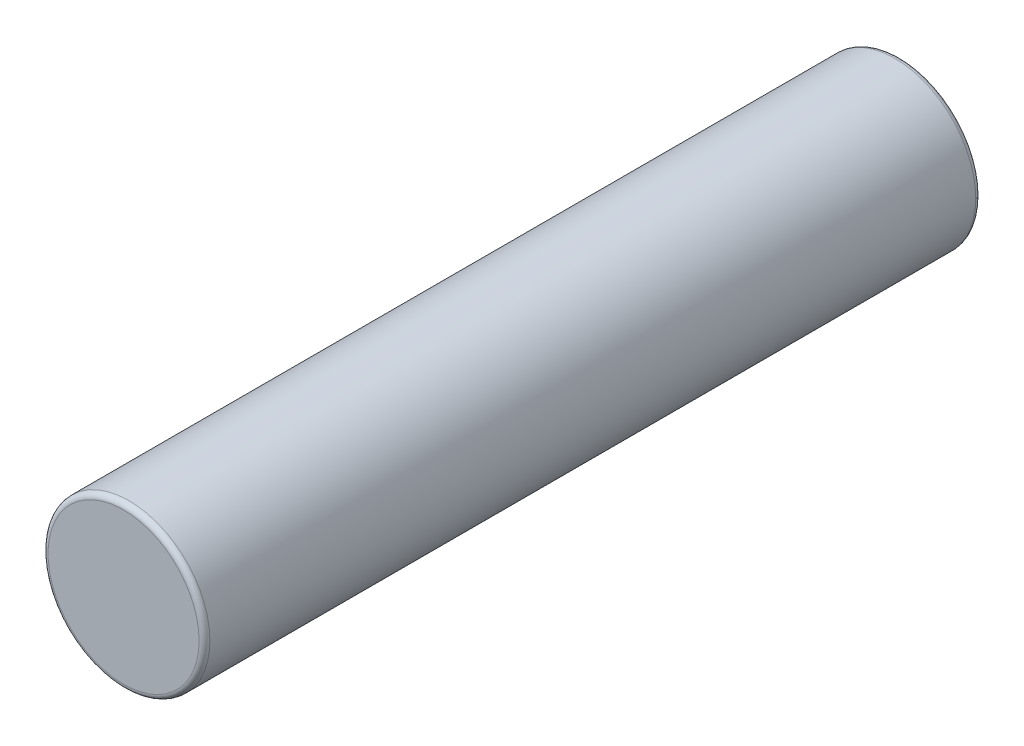
ISO-10303-21;
HEADER;
FILE_DESCRIPTION(('STEP AP214'),'2;1');
FILE_NAME('part.step','',(''),(''),'','','');
FILE_SCHEMA(('AUTOMOTIVE_DESIGN { 1 0 10303 214 1 1 1 1 }'));
ENDSEC;
DATA;
#1=APPLICATION_CONTEXT('core data for automotive mechanical design processes');
#2=APPLICATION_PROTOCOL_DEFINITION('international standard','automotive_design',2000,#1);
#3=PRODUCT_CONTEXT('',#1,'mechanical');
#4=PRODUCT('Part','Part','',(#3));
#5=PRODUCT_RELATED_PRODUCT_CATEGORY('part','',(#4));
#6=PRODUCT_DEFINITION_FORMATION('','',#4);
#7=PRODUCT_DEFINITION_CONTEXT('part definition',#1,'design');
#8=PRODUCT_DEFINITION('design','',#6,#7);
#9=PRODUCT_DEFINITION_SHAPE('','',#8);
#10=(LENGTH_UNIT() NAMED_UNIT(*) SI_UNIT(.MILLI.,.METRE.));
#11=(NAMED_UNIT(*) PLANE_ANGLE_UNIT() SI_UNIT($,.RADIAN.));
#12=(NAMED_UNIT(*) SI_UNIT($,.STERADIAN.) SOLID_ANGLE_UNIT());
#13=UNCERTAINTY_MEASURE_WITH_UNIT(LENGTH_MEASURE(1.E-05),#10,'distance_accuracy_value','');
#14=(GEOMETRIC_REPRESENTATION_CONTEXT(3) GLOBAL_UNCERTAINTY_ASSIGNED_CONTEXT((#13)) GLOBAL_UNIT_ASSIGNED_CONTEXT((#10,
#11,#12)) REPRESENTATION_CONTEXT('',''));
#15=CARTESIAN_POINT('',(0.,0.,0.));
#16=DIRECTION('',(0.,0.,1.));
#17=DIRECTION('',(1.,0.,0.));
#18=AXIS2_PLACEMENT_3D('',#15,#16,#17);
#19=CARTESIAN_POINT('',(0.,0.,7.2));
#20=DIRECTION('',(0.,0.,-1.));
#21=DIRECTION('',(-1.,0.,0.));
#22=AXIS2_PLACEMENT_3D('',#19,#20,#21);
#23=CYLINDRICAL_SURFACE('',#22,0.75);
#24=CARTESIAN_POINT('',(0.,0.,0.0500000000000014));
#25=DIRECTION('',(0.,0.,1.));
#26=DIRECTION('',(1.,0.,0.));
#27=AXIS2_PLACEMENT_3D('',#24,#25,#26);
#28=CIRCLE('',#27,0.75);
#29=CARTESIAN_POINT('',(0.75,0.,0.0500000000000014));
#30=VERTEX_POINT('',#29);
#31=EDGE_CURVE('E41',#30,#30,#28,.T.);
#32=ORIENTED_EDGE('',*,*,#31,.T.);
#33=EDGE_LOOP('',(#32));
#34=FACE_BOUND('',#33,.T.);
#35=CARTESIAN_POINT('',(0.,0.,7.15));
#36=DIRECTION('',(0.,0.,1.));
#37=DIRECTION('',(1.,0.,0.));
#38=AXIS2_PLACEMENT_3D('',#35,#36,#37);
#39=CIRCLE('',#38,0.75);
#40=CARTESIAN_POINT('',(0.75,0.,7.15));
#41=VERTEX_POINT('',#40);
#42=EDGE_CURVE('E45',#41,#41,#39,.F.);
#43=ORIENTED_EDGE('',*,*,#42,.T.);
#44=EDGE_LOOP('',(#43));
#45=FACE_BOUND('',#44,.T.);
#46=ADVANCED_FACE('F30',(#34,#45),#23,.T.);
#47=CARTESIAN_POINT('',(0.,0.,7.2));
#48=DIRECTION('',(0.,0.,1.));
#49=DIRECTION('',(1.,0.,0.));
#50=AXIS2_PLACEMENT_3D('',#47,#48,#49);
#51=PLANE('',#50);
#52=CARTESIAN_POINT('',(0.,0.,7.2));
#53=DIRECTION('',(0.,0.,1.));
#54=DIRECTION('',(1.,0.,0.));
#55=AXIS2_PLACEMENT_3D('',#52,#53,#54);
#56=CIRCLE('',#55,0.7);
#57=CARTESIAN_POINT('',(0.7,0.,7.2));
#58=VERTEX_POINT('',#57);
#59=EDGE_CURVE('E10',#58,#58,#56,.T.);
#60=ORIENTED_EDGE('',*,*,#59,.T.);
#61=EDGE_LOOP('',(#60));
#62=FACE_BOUND('',#61,.T.);
#63=ADVANCED_FACE('F61',(#62),#51,.T.);
#64=CARTESIAN_POINT('',(0.,0.,0.));
#65=DIRECTION('',(0.,0.,1.));
#66=DIRECTION('',(1.,0.,0.));
#67=AXIS2_PLACEMENT_3D('',#64,#65,#66);
#68=PLANE('',#67);
#69=CARTESIAN_POINT('',(0.,0.,0.));
#70=DIRECTION('',(0.,0.,1.));
#71=DIRECTION('',(1.,0.,0.));
#72=AXIS2_PLACEMENT_3D('',#69,#70,#71);
#73=CIRCLE('',#72,0.7);
#74=CARTESIAN_POINT('',(0.7,0.,0.));
#75=VERTEX_POINT('',#74);
#76=EDGE_CURVE('E37',#75,#75,#73,.F.);
#77=ORIENTED_EDGE('',*,*,#76,.T.);
#78=EDGE_LOOP('',(#77));
#79=FACE_BOUND('',#78,.T.);
#80=ADVANCED_FACE('F58',(#79),#68,.F.);
#81=CARTESIAN_POINT('',(0.,0.,0.0500000000000014));
#82=DIRECTION('',(0.,0.,1.));
#83=DIRECTION('',(1.,0.,0.));
#84=AXIS2_PLACEMENT_3D('',#81,#82,#83);
#85=TOROIDAL_SURFACE('',#84,0.7,0.05);
#86=ORIENTED_EDGE('',*,*,#76,.F.);
#87=EDGE_LOOP('',(#86));
#88=FACE_BOUND('',#87,.T.);
#89=ORIENTED_EDGE('',*,*,#31,.F.);
#90=EDGE_LOOP('',(#89));
#91=FACE_BOUND('',#90,.T.);
#92=ADVANCED_FACE('F54',(#88,#91),#85,.T.);
#93=CARTESIAN_POINT('',(0.,0.,7.15));
#94=DIRECTION('',(0.,0.,1.));
#95=DIRECTION('',(1.,0.,0.));
#96=AXIS2_PLACEMENT_3D('',#93,#94,#95);
#97=TOROIDAL_SURFACE('',#96,0.7,0.05);
#98=ORIENTED_EDGE('',*,*,#42,.F.);
#99=EDGE_LOOP('',(#98));
#100=FACE_BOUND('',#99,.T.);
#101=ORIENTED_EDGE('',*,*,#59,.F.);
#102=EDGE_LOOP('',(#101));
#103=FACE_BOUND('',#102,.T.);
#104=ADVANCED_FACE('F32',(#100,#103),#97,.T.);
#105=CLOSED_SHELL('',(#46,#63,#80,#92,#104));
#106=MANIFOLD_SOLID_BREP('B2',#105);
#107=ADVANCED_BREP_SHAPE_REPRESENTATION('',(#18,#106),#14);
#108=SHAPE_DEFINITION_REPRESENTATION(#9,#107);
ENDSEC;
END-ISO-10303-21;
